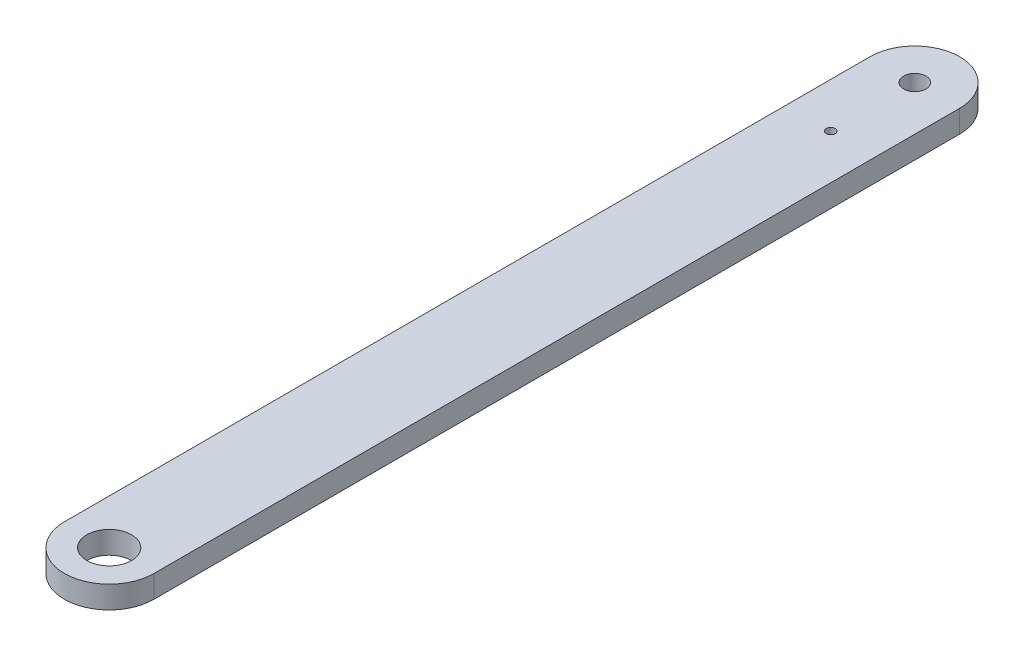
ISO-10303-21;
HEADER;
FILE_DESCRIPTION(('STEP AP214'),'2;1');
FILE_NAME('part.step','',(''),(''),'','','');
FILE_SCHEMA(('AUTOMOTIVE_DESIGN { 1 0 10303 214 1 1 1 1 }'));
ENDSEC;
DATA;
#1=APPLICATION_CONTEXT('core data for automotive mechanical design processes');
#2=APPLICATION_PROTOCOL_DEFINITION('international standard','automotive_design',2000,#1);
#3=PRODUCT_CONTEXT('',#1,'mechanical');
#4=PRODUCT('Part','Part','',(#3));
#5=PRODUCT_RELATED_PRODUCT_CATEGORY('part','',(#4));
#6=PRODUCT_DEFINITION_FORMATION('','',#4);
#7=PRODUCT_DEFINITION_CONTEXT('part definition',#1,'design');
#8=PRODUCT_DEFINITION('design','',#6,#7);
#9=PRODUCT_DEFINITION_SHAPE('','',#8);
#10=(LENGTH_UNIT() NAMED_UNIT(*) SI_UNIT(.MILLI.,.METRE.));
#11=(NAMED_UNIT(*) PLANE_ANGLE_UNIT() SI_UNIT($,.RADIAN.));
#12=(NAMED_UNIT(*) SI_UNIT($,.STERADIAN.) SOLID_ANGLE_UNIT());
#13=UNCERTAINTY_MEASURE_WITH_UNIT(LENGTH_MEASURE(1.E-05),#10,'distance_accuracy_value','');
#14=(GEOMETRIC_REPRESENTATION_CONTEXT(3) GLOBAL_UNCERTAINTY_ASSIGNED_CONTEXT((#13)) GLOBAL_UNIT_ASSIGNED_CONTEXT((#10,
#11,#12)) REPRESENTATION_CONTEXT('',''));
#15=CARTESIAN_POINT('',(0.,0.,0.));
#16=DIRECTION('',(0.,0.,1.));
#17=DIRECTION('',(1.,0.,0.));
#18=AXIS2_PLACEMENT_3D('',#15,#16,#17);
#19=CARTESIAN_POINT('',(0.,5.,-90.));
#20=DIRECTION('',(0.,-1.,0.));
#21=DIRECTION('',(0.,0.,-1.));
#22=AXIS2_PLACEMENT_3D('',#19,#20,#21);
#23=CYLINDRICAL_SURFACE('',#22,10.);
#24=CARTESIAN_POINT('',(0.,0.,-90.));
#25=DIRECTION('',(0.,1.,0.));
#26=DIRECTION('',(0.,0.,1.));
#27=AXIS2_PLACEMENT_3D('',#24,#25,#26);
#28=CIRCLE('',#27,10.);
#29=CARTESIAN_POINT('',(10.,0.,-90.));
#30=VERTEX_POINT('',#29);
#31=CARTESIAN_POINT('',(-10.,0.,-90.));
#32=VERTEX_POINT('',#31);
#33=EDGE_CURVE('E101',#30,#32,#28,.T.);
#34=ORIENTED_EDGE('',*,*,#33,.T.);
#35=DIRECTION('',(0.,-1.,0.));
#36=VECTOR('',#35,1.);
#37=CARTESIAN_POINT('',(-10.,5.,-90.));
#38=LINE('',#37,#36);
#39=CARTESIAN_POINT('',(-10.,5.,-90.));
#40=VERTEX_POINT('',#39);
#41=EDGE_CURVE('E11',#40,#32,#38,.T.);
#42=ORIENTED_EDGE('',*,*,#41,.F.);
#43=CARTESIAN_POINT('',(0.,5.,-90.));
#44=DIRECTION('',(0.,1.,0.));
#45=DIRECTION('',(0.,0.,1.));
#46=AXIS2_PLACEMENT_3D('',#43,#44,#45);
#47=CIRCLE('',#46,10.);
#48=CARTESIAN_POINT('',(10.,5.,-90.));
#49=VERTEX_POINT('',#48);
#50=EDGE_CURVE('E75',#49,#40,#47,.T.);
#51=ORIENTED_EDGE('',*,*,#50,.F.);
#52=DIRECTION('',(0.,-1.,0.));
#53=VECTOR('',#52,1.);
#54=CARTESIAN_POINT('',(10.,5.,-90.));
#55=LINE('',#54,#53);
#56=EDGE_CURVE('E94',#49,#30,#55,.T.);
#57=ORIENTED_EDGE('',*,*,#56,.T.);
#58=EDGE_LOOP('',(#34,#42,#51,#57));
#59=FACE_BOUND('',#58,.T.);
#60=ADVANCED_FACE('F35',(#59),#23,.T.);
#61=CARTESIAN_POINT('',(-10.,5.,0.));
#62=DIRECTION('',(-1.,0.,0.));
#63=DIRECTION('',(0.,0.,1.));
#64=AXIS2_PLACEMENT_3D('',#61,#62,#63);
#65=PLANE('',#64);
#66=DIRECTION('',(0.,0.,-1.));
#67=VECTOR('',#66,1.);
#68=CARTESIAN_POINT('',(-10.,0.,0.));
#69=LINE('',#68,#67);
#70=CARTESIAN_POINT('',(-10.,0.,90.));
#71=VERTEX_POINT('',#70);
#72=EDGE_CURVE('E84',#71,#32,#69,.T.);
#73=ORIENTED_EDGE('',*,*,#72,.F.);
#74=DIRECTION('',(0.,-1.,0.));
#75=VECTOR('',#74,1.);
#76=CARTESIAN_POINT('',(-10.,5.,90.));
#77=LINE('',#76,#75);
#78=CARTESIAN_POINT('',(-10.,5.,90.));
#79=VERTEX_POINT('',#78);
#80=EDGE_CURVE('E44',#79,#71,#77,.T.);
#81=ORIENTED_EDGE('',*,*,#80,.F.);
#82=DIRECTION('',(0.,0.,-1.));
#83=VECTOR('',#82,1.);
#84=CARTESIAN_POINT('',(-10.,5.,0.));
#85=LINE('',#84,#83);
#86=EDGE_CURVE('E82',#79,#40,#85,.T.);
#87=ORIENTED_EDGE('',*,*,#86,.T.);
#88=ORIENTED_EDGE('',*,*,#41,.T.);
#89=EDGE_LOOP('',(#73,#81,#87,#88));
#90=FACE_BOUND('',#89,.T.);
#91=ADVANCED_FACE('F81',(#90),#65,.T.);
#92=CARTESIAN_POINT('',(0.,5.,90.));
#93=DIRECTION('',(0.,-1.,0.));
#94=DIRECTION('',(0.,0.,-1.));
#95=AXIS2_PLACEMENT_3D('',#92,#93,#94);
#96=CYLINDRICAL_SURFACE('',#95,10.);
#97=CARTESIAN_POINT('',(0.,0.,90.));
#98=DIRECTION('',(0.,1.,0.));
#99=DIRECTION('',(0.,0.,1.));
#100=AXIS2_PLACEMENT_3D('',#97,#98,#99);
#101=CIRCLE('',#100,10.);
#102=CARTESIAN_POINT('',(10.,0.,90.));
#103=VERTEX_POINT('',#102);
#104=EDGE_CURVE('E106',#103,#71,#101,.F.);
#105=ORIENTED_EDGE('',*,*,#104,.F.);
#106=DIRECTION('',(0.,-1.,0.));
#107=VECTOR('',#106,1.);
#108=CARTESIAN_POINT('',(10.,5.,90.));
#109=LINE('',#108,#107);
#110=CARTESIAN_POINT('',(10.,5.,90.));
#111=VERTEX_POINT('',#110);
#112=EDGE_CURVE('E67',#111,#103,#109,.T.);
#113=ORIENTED_EDGE('',*,*,#112,.F.);
#114=CARTESIAN_POINT('',(0.,5.,90.));
#115=DIRECTION('',(0.,1.,0.));
#116=DIRECTION('',(0.,0.,1.));
#117=AXIS2_PLACEMENT_3D('',#114,#115,#116);
#118=CIRCLE('',#117,10.);
#119=EDGE_CURVE('E90',#111,#79,#118,.F.);
#120=ORIENTED_EDGE('',*,*,#119,.T.);
#121=ORIENTED_EDGE('',*,*,#80,.T.);
#122=EDGE_LOOP('',(#105,#113,#120,#121));
#123=FACE_BOUND('',#122,.T.);
#124=ADVANCED_FACE('F92',(#123),#96,.T.);
#125=CARTESIAN_POINT('',(0.,5.,-90.));
#126=DIRECTION('',(0.,-1.,0.));
#127=DIRECTION('',(0.,0.,-1.));
#128=AXIS2_PLACEMENT_3D('',#125,#126,#127);
#129=CYLINDRICAL_SURFACE('',#128,2.50000000000001);
#130=CARTESIAN_POINT('',(0.,5.,-90.));
#131=DIRECTION('',(0.,1.,0.));
#132=DIRECTION('',(0.,0.,1.));
#133=AXIS2_PLACEMENT_3D('',#130,#131,#132);
#134=CIRCLE('',#133,2.50000000000001);
#135=CARTESIAN_POINT('',(0.,5.,-87.5));
#136=VERTEX_POINT('',#135);
#137=EDGE_CURVE('E109',#136,#136,#134,.T.);
#138=ORIENTED_EDGE('',*,*,#137,.T.);
#139=EDGE_LOOP('',(#138));
#140=FACE_BOUND('',#139,.T.);
#141=CARTESIAN_POINT('',(0.,0.,-90.));
#142=DIRECTION('',(0.,1.,0.));
#143=DIRECTION('',(0.,0.,1.));
#144=AXIS2_PLACEMENT_3D('',#141,#142,#143);
#145=CIRCLE('',#144,2.50000000000001);
#146=CARTESIAN_POINT('',(0.,0.,-87.5));
#147=VERTEX_POINT('',#146);
#148=EDGE_CURVE('E98',#147,#147,#145,.T.);
#149=ORIENTED_EDGE('',*,*,#148,.F.);
#150=EDGE_LOOP('',(#149));
#151=FACE_BOUND('',#150,.T.);
#152=ADVANCED_FACE('F37',(#140,#151),#129,.F.);
#153=CARTESIAN_POINT('',(10.,5.,0.));
#154=DIRECTION('',(-1.,0.,0.));
#155=DIRECTION('',(0.,0.,1.));
#156=AXIS2_PLACEMENT_3D('',#153,#154,#155);
#157=PLANE('',#156);
#158=DIRECTION('',(0.,0.,-1.));
#159=VECTOR('',#158,1.);
#160=CARTESIAN_POINT('',(10.,0.,0.));
#161=LINE('',#160,#159);
#162=EDGE_CURVE('E70',#103,#30,#161,.T.);
#163=ORIENTED_EDGE('',*,*,#162,.T.);
#164=ORIENTED_EDGE('',*,*,#56,.F.);
#165=DIRECTION('',(0.,0.,-1.));
#166=VECTOR('',#165,1.);
#167=CARTESIAN_POINT('',(10.,5.,0.));
#168=LINE('',#167,#166);
#169=EDGE_CURVE('E52',#111,#49,#168,.T.);
#170=ORIENTED_EDGE('',*,*,#169,.F.);
#171=ORIENTED_EDGE('',*,*,#112,.T.);
#172=EDGE_LOOP('',(#163,#164,#170,#171));
#173=FACE_BOUND('',#172,.T.);
#174=ADVANCED_FACE('F126',(#173),#157,.F.);
#175=CARTESIAN_POINT('',(0.,5.,0.));
#176=DIRECTION('',(0.,1.,0.));
#177=DIRECTION('',(0.,0.,1.));
#178=AXIS2_PLACEMENT_3D('',#175,#176,#177);
#179=PLANE('',#178);
#180=CARTESIAN_POINT('',(0.,5.,90.));
#181=DIRECTION('',(0.,1.,0.));
#182=DIRECTION('',(0.,0.,1.));
#183=AXIS2_PLACEMENT_3D('',#180,#181,#182);
#184=CIRCLE('',#183,5.);
#185=CARTESIAN_POINT('',(0.,5.,95.));
#186=VERTEX_POINT('',#185);
#187=EDGE_CURVE('E160',#186,#186,#184,.T.);
#188=ORIENTED_EDGE('',*,*,#187,.F.);
#189=EDGE_LOOP('',(#188));
#190=FACE_BOUND('',#189,.T.);
#191=CARTESIAN_POINT('',(0.,5.,-71.2099044713463));
#192=DIRECTION('',(0.,-1.,0.));
#193=DIRECTION('',(0.,0.,-1.));
#194=AXIS2_PLACEMENT_3D('',#191,#192,#193);
#195=CIRCLE('',#194,1.);
#196=CARTESIAN_POINT('',(0.,5.,-72.2099044713463));
#197=VERTEX_POINT('',#196);
#198=EDGE_CURVE('E102',#197,#197,#195,.T.);
#199=ORIENTED_EDGE('',*,*,#198,.T.);
#200=EDGE_LOOP('',(#199));
#201=FACE_BOUND('',#200,.T.);
#202=ORIENTED_EDGE('',*,*,#137,.F.);
#203=EDGE_LOOP('',(#202));
#204=FACE_BOUND('',#203,.T.);
#205=ORIENTED_EDGE('',*,*,#50,.T.);
#206=ORIENTED_EDGE('',*,*,#86,.F.);
#207=ORIENTED_EDGE('',*,*,#119,.F.);
#208=ORIENTED_EDGE('',*,*,#169,.T.);
#209=EDGE_LOOP('',(#205,#206,#207,#208));
#210=FACE_BOUND('',#209,.T.);
#211=ADVANCED_FACE('F89',(#190,#201,#204,#210),#179,.T.);
#212=CARTESIAN_POINT('',(0.,0.,0.));
#213=DIRECTION('',(0.,1.,0.));
#214=DIRECTION('',(0.,0.,1.));
#215=AXIS2_PLACEMENT_3D('',#212,#213,#214);
#216=PLANE('',#215);
#217=CARTESIAN_POINT('',(0.,0.,90.));
#218=DIRECTION('',(0.,1.,0.));
#219=DIRECTION('',(0.,0.,1.));
#220=AXIS2_PLACEMENT_3D('',#217,#218,#219);
#221=CIRCLE('',#220,5.);
#222=CARTESIAN_POINT('',(0.,0.,95.));
#223=VERTEX_POINT('',#222);
#224=EDGE_CURVE('E157',#223,#223,#221,.T.);
#225=ORIENTED_EDGE('',*,*,#224,.T.);
#226=EDGE_LOOP('',(#225));
#227=FACE_BOUND('',#226,.T.);
#228=CARTESIAN_POINT('',(0.,0.,-71.2099044713463));
#229=DIRECTION('',(0.,-1.,0.));
#230=DIRECTION('',(0.,0.,-1.));
#231=AXIS2_PLACEMENT_3D('',#228,#229,#230);
#232=CIRCLE('',#231,1.);
#233=CARTESIAN_POINT('',(0.,0.,-72.2099044713463));
#234=VERTEX_POINT('',#233);
#235=EDGE_CURVE('E154',#234,#234,#232,.T.);
#236=ORIENTED_EDGE('',*,*,#235,.F.);
#237=EDGE_LOOP('',(#236));
#238=FACE_BOUND('',#237,.T.);
#239=ORIENTED_EDGE('',*,*,#148,.T.);
#240=EDGE_LOOP('',(#239));
#241=FACE_BOUND('',#240,.T.);
#242=ORIENTED_EDGE('',*,*,#33,.F.);
#243=ORIENTED_EDGE('',*,*,#162,.F.);
#244=ORIENTED_EDGE('',*,*,#104,.T.);
#245=ORIENTED_EDGE('',*,*,#72,.T.);
#246=EDGE_LOOP('',(#242,#243,#244,#245));
#247=FACE_BOUND('',#246,.T.);
#248=ADVANCED_FACE('F114',(#227,#238,#241,#247),#216,.F.);
#249=CARTESIAN_POINT('',(0.,5.,-71.2099044713463));
#250=DIRECTION('',(0.,-1.,0.));
#251=DIRECTION('',(0.,0.,-1.));
#252=AXIS2_PLACEMENT_3D('',#249,#250,#251);
#253=CYLINDRICAL_SURFACE('',#252,1.);
#254=ORIENTED_EDGE('',*,*,#198,.F.);
#255=EDGE_LOOP('',(#254));
#256=FACE_BOUND('',#255,.T.);
#257=ORIENTED_EDGE('',*,*,#235,.T.);
#258=EDGE_LOOP('',(#257));
#259=FACE_BOUND('',#258,.T.);
#260=ADVANCED_FACE('F116',(#256,#259),#253,.F.);
#261=CARTESIAN_POINT('',(0.,0.,90.));
#262=DIRECTION('',(0.,1.,0.));
#263=DIRECTION('',(0.,0.,1.));
#264=AXIS2_PLACEMENT_3D('',#261,#262,#263);
#265=CYLINDRICAL_SURFACE('',#264,5.);
#266=ORIENTED_EDGE('',*,*,#224,.F.);
#267=EDGE_LOOP('',(#266));
#268=FACE_BOUND('',#267,.T.);
#269=ORIENTED_EDGE('',*,*,#187,.T.);
#270=EDGE_LOOP('',(#269));
#271=FACE_BOUND('',#270,.T.);
#272=ADVANCED_FACE('F123',(#268,#271),#265,.F.);
#273=CLOSED_SHELL('',(#60,#91,#124,#152,#174,#211,#248,#260,#272));
#274=MANIFOLD_SOLID_BREP('B2',#273);
#275=ADVANCED_BREP_SHAPE_REPRESENTATION('',(#18,#274),#14);
#276=SHAPE_DEFINITION_REPRESENTATION(#9,#275);
ENDSEC;
END-ISO-10303-21;
